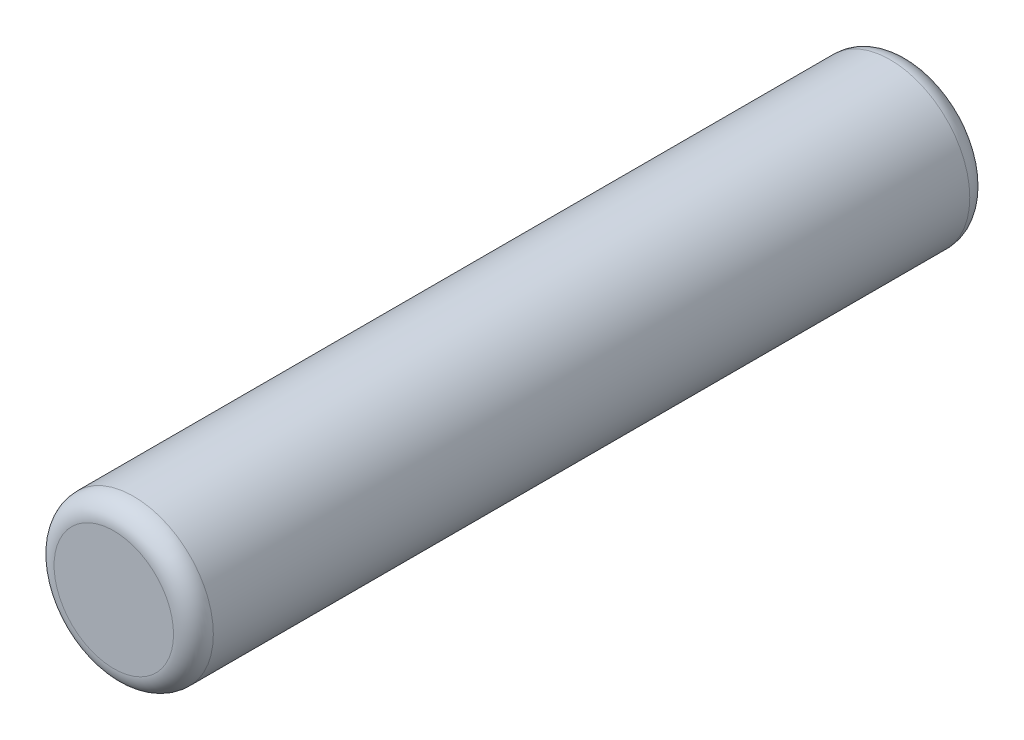
ISO-10303-21;
HEADER;
FILE_DESCRIPTION(('STEP AP214'),'2;1');
FILE_NAME('part.step','',(''),(''),'','','');
FILE_SCHEMA(('AUTOMOTIVE_DESIGN { 1 0 10303 214 1 1 1 1 }'));
ENDSEC;
DATA;
#1=APPLICATION_CONTEXT('core data for automotive mechanical design processes');
#2=APPLICATION_PROTOCOL_DEFINITION('international standard','automotive_design',2000,#1);
#3=PRODUCT_CONTEXT('',#1,'mechanical');
#4=PRODUCT('Part','Part','',(#3));
#5=PRODUCT_RELATED_PRODUCT_CATEGORY('part','',(#4));
#6=PRODUCT_DEFINITION_FORMATION('','',#4);
#7=PRODUCT_DEFINITION_CONTEXT('part definition',#1,'design');
#8=PRODUCT_DEFINITION('design','',#6,#7);
#9=PRODUCT_DEFINITION_SHAPE('','',#8);
#10=(LENGTH_UNIT() NAMED_UNIT(*) SI_UNIT(.MILLI.,.METRE.));
#11=(NAMED_UNIT(*) PLANE_ANGLE_UNIT() SI_UNIT($,.RADIAN.));
#12=(NAMED_UNIT(*) SI_UNIT($,.STERADIAN.) SOLID_ANGLE_UNIT());
#13=UNCERTAINTY_MEASURE_WITH_UNIT(LENGTH_MEASURE(1.E-05),#10,'distance_accuracy_value','');
#14=(GEOMETRIC_REPRESENTATION_CONTEXT(3) GLOBAL_UNCERTAINTY_ASSIGNED_CONTEXT((#13)) GLOBAL_UNIT_ASSIGNED_CONTEXT((#10,
#11,#12)) REPRESENTATION_CONTEXT('',''));
#15=CARTESIAN_POINT('',(0.,0.,0.));
#16=DIRECTION('',(0.,0.,1.));
#17=DIRECTION('',(1.,0.,0.));
#18=AXIS2_PLACEMENT_3D('',#15,#16,#17);
#19=CARTESIAN_POINT('',(0.,0.,20.));
#20=DIRECTION('',(0.,0.,-1.));
#21=DIRECTION('',(-1.,0.,0.));
#22=AXIS2_PLACEMENT_3D('',#19,#20,#21);
#23=CYLINDRICAL_SURFACE('',#22,4.);
#24=CARTESIAN_POINT('',(0.,0.,-19.));
#25=DIRECTION('',(0.,0.,1.));
#26=DIRECTION('',(1.,0.,0.));
#27=AXIS2_PLACEMENT_3D('',#24,#25,#26);
#28=CIRCLE('',#27,4.);
#29=CARTESIAN_POINT('',(4.,0.,-19.));
#30=VERTEX_POINT('',#29);
#31=EDGE_CURVE('E57',#30,#30,#28,.T.);
#32=ORIENTED_EDGE('',*,*,#31,.T.);
#33=EDGE_LOOP('',(#32));
#34=FACE_BOUND('',#33,.T.);
#35=CARTESIAN_POINT('',(0.,0.,19.));
#36=DIRECTION('',(0.,0.,1.));
#37=DIRECTION('',(1.,0.,0.));
#38=AXIS2_PLACEMENT_3D('',#35,#36,#37);
#39=CIRCLE('',#38,4.);
#40=CARTESIAN_POINT('',(4.,0.,19.));
#41=VERTEX_POINT('',#40);
#42=EDGE_CURVE('E64',#41,#41,#39,.F.);
#43=ORIENTED_EDGE('',*,*,#42,.T.);
#44=EDGE_LOOP('',(#43));
#45=FACE_BOUND('',#44,.T.);
#46=ADVANCED_FACE('F43',(#34,#45),#23,.T.);
#47=CARTESIAN_POINT('',(0.,0.,20.));
#48=DIRECTION('',(0.,0.,1.));
#49=DIRECTION('',(1.,0.,0.));
#50=AXIS2_PLACEMENT_3D('',#47,#48,#49);
#51=PLANE('',#50);
#52=CARTESIAN_POINT('',(0.,0.,20.));
#53=DIRECTION('',(0.,0.,1.));
#54=DIRECTION('',(1.,0.,0.));
#55=AXIS2_PLACEMENT_3D('',#52,#53,#54);
#56=CIRCLE('',#55,3.);
#57=CARTESIAN_POINT('',(3.,0.,20.));
#58=VERTEX_POINT('',#57);
#59=EDGE_CURVE('E10',#58,#58,#56,.T.);
#60=ORIENTED_EDGE('',*,*,#59,.T.);
#61=EDGE_LOOP('',(#60));
#62=FACE_BOUND('',#61,.T.);
#63=ADVANCED_FACE('F80',(#62),#51,.T.);
#64=CARTESIAN_POINT('',(0.,0.,-20.));
#65=DIRECTION('',(0.,0.,1.));
#66=DIRECTION('',(1.,0.,0.));
#67=AXIS2_PLACEMENT_3D('',#64,#65,#66);
#68=PLANE('',#67);
#69=CARTESIAN_POINT('',(0.,0.,-20.));
#70=DIRECTION('',(0.,0.,1.));
#71=DIRECTION('',(1.,0.,0.));
#72=AXIS2_PLACEMENT_3D('',#69,#70,#71);
#73=CIRCLE('',#72,3.);
#74=CARTESIAN_POINT('',(3.,0.,-20.));
#75=VERTEX_POINT('',#74);
#76=EDGE_CURVE('E51',#75,#75,#73,.F.);
#77=ORIENTED_EDGE('',*,*,#76,.T.);
#78=EDGE_LOOP('',(#77));
#79=FACE_BOUND('',#78,.T.);
#80=ADVANCED_FACE('F73',(#79),#68,.F.);
#81=CARTESIAN_POINT('',(0.,0.,-19.));
#82=DIRECTION('',(0.,0.,1.));
#83=DIRECTION('',(1.,0.,0.));
#84=AXIS2_PLACEMENT_3D('',#81,#82,#83);
#85=TOROIDAL_SURFACE('',#84,3.,1.);
#86=ORIENTED_EDGE('',*,*,#76,.F.);
#87=EDGE_LOOP('',(#86));
#88=FACE_BOUND('',#87,.T.);
#89=ORIENTED_EDGE('',*,*,#31,.F.);
#90=EDGE_LOOP('',(#89));
#91=FACE_BOUND('',#90,.T.);
#92=ADVANCED_FACE('F72',(#88,#91),#85,.T.);
#93=CARTESIAN_POINT('',(0.,0.,19.));
#94=DIRECTION('',(0.,0.,1.));
#95=DIRECTION('',(1.,0.,0.));
#96=AXIS2_PLACEMENT_3D('',#93,#94,#95);
#97=TOROIDAL_SURFACE('',#96,3.,1.);
#98=ORIENTED_EDGE('',*,*,#42,.F.);
#99=EDGE_LOOP('',(#98));
#100=FACE_BOUND('',#99,.T.);
#101=ORIENTED_EDGE('',*,*,#59,.F.);
#102=EDGE_LOOP('',(#101));
#103=FACE_BOUND('',#102,.T.);
#104=ADVANCED_FACE('F44',(#100,#103),#97,.T.);
#105=CLOSED_SHELL('',(#46,#63,#80,#92,#104));
#106=MANIFOLD_SOLID_BREP('B2',#105);
#107=ADVANCED_BREP_SHAPE_REPRESENTATION('',(#18,#106),#14);
#108=SHAPE_DEFINITION_REPRESENTATION(#9,#107);
ENDSEC;
END-ISO-10303-21;
